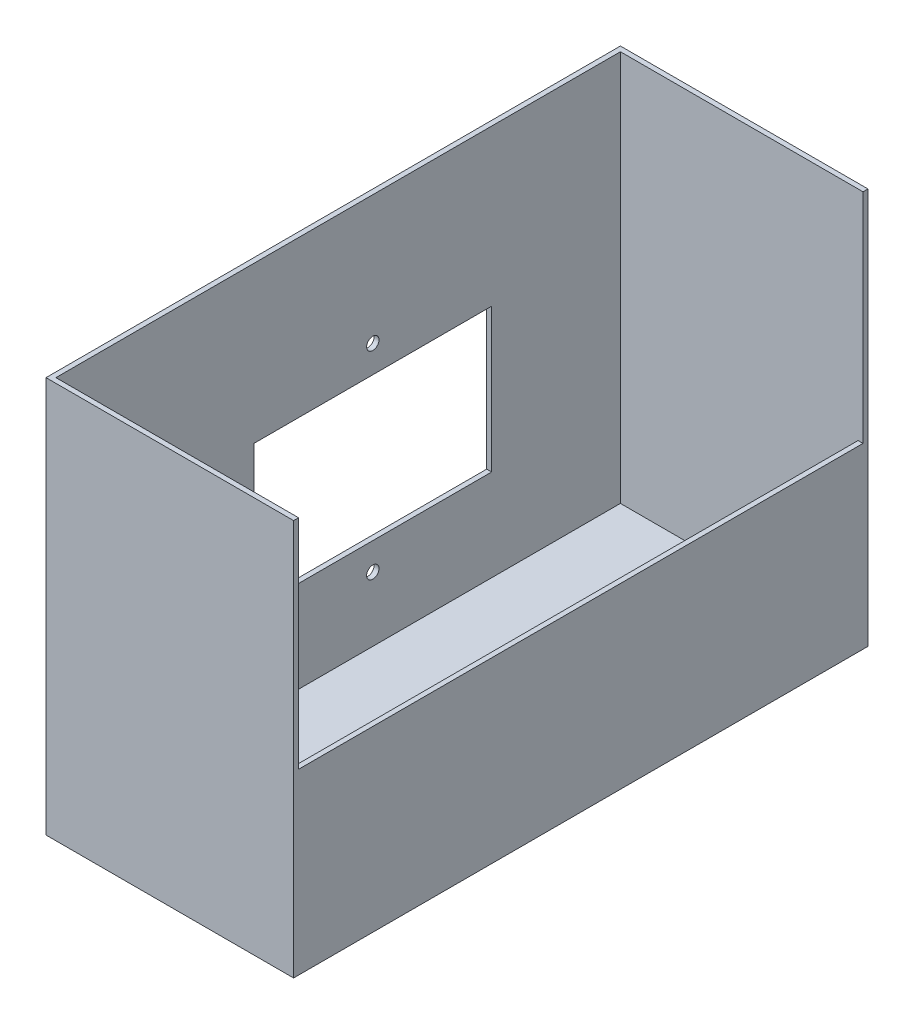
ISO-10303-21;
HEADER;
FILE_DESCRIPTION(('STEP AP214'),'2;1');
FILE_NAME('part.step','',(''),(''),'','','');
FILE_SCHEMA(('AUTOMOTIVE_DESIGN { 1 0 10303 214 1 1 1 1 }'));
ENDSEC;
DATA;
#1=APPLICATION_CONTEXT('core data for automotive mechanical design processes');
#2=APPLICATION_PROTOCOL_DEFINITION('international standard','automotive_design',2000,#1);
#3=PRODUCT_CONTEXT('',#1,'mechanical');
#4=PRODUCT('Part','Part','',(#3));
#5=PRODUCT_RELATED_PRODUCT_CATEGORY('part','',(#4));
#6=PRODUCT_DEFINITION_FORMATION('','',#4);
#7=PRODUCT_DEFINITION_CONTEXT('part definition',#1,'design');
#8=PRODUCT_DEFINITION('design','',#6,#7);
#9=PRODUCT_DEFINITION_SHAPE('','',#8);
#10=(LENGTH_UNIT() NAMED_UNIT(*) SI_UNIT(.MILLI.,.METRE.));
#11=(NAMED_UNIT(*) PLANE_ANGLE_UNIT() SI_UNIT($,.RADIAN.));
#12=(NAMED_UNIT(*) SI_UNIT($,.STERADIAN.) SOLID_ANGLE_UNIT());
#13=UNCERTAINTY_MEASURE_WITH_UNIT(LENGTH_MEASURE(1.E-05),#10,'distance_accuracy_value','');
#14=(GEOMETRIC_REPRESENTATION_CONTEXT(3) GLOBAL_UNCERTAINTY_ASSIGNED_CONTEXT((#13)) GLOBAL_UNIT_ASSIGNED_CONTEXT((#10,
#11,#12)) REPRESENTATION_CONTEXT('',''));
#15=CARTESIAN_POINT('',(0.,0.,0.));
#16=DIRECTION('',(0.,0.,1.));
#17=DIRECTION('',(1.,0.,0.));
#18=AXIS2_PLACEMENT_3D('',#15,#16,#17);
#19=CARTESIAN_POINT('',(0.,0.,0.));
#20=DIRECTION('',(1.,0.,0.));
#21=DIRECTION('',(0.,1.,0.));
#22=AXIS2_PLACEMENT_3D('',#19,#20,#21);
#23=PLANE('',#22);
#24=DIRECTION('',(0.,0.,-1.));
#25=VECTOR('',#24,1.);
#26=CARTESIAN_POINT('',(0.,-14.5,24.));
#27=LINE('',#26,#25);
#28=CARTESIAN_POINT('',(0.,-14.5,24.));
#29=VERTEX_POINT('',#28);
#30=CARTESIAN_POINT('',(0.,-14.5,-24.));
#31=VERTEX_POINT('',#30);
#32=EDGE_CURVE('E165',#29,#31,#27,.T.);
#33=ORIENTED_EDGE('',*,*,#32,.T.);
#34=DIRECTION('',(0.,1.,0.));
#35=VECTOR('',#34,1.);
#36=CARTESIAN_POINT('',(0.,-14.5,-24.));
#37=LINE('',#36,#35);
#38=CARTESIAN_POINT('',(0.,14.5,-24.));
#39=VERTEX_POINT('',#38);
#40=EDGE_CURVE('E172',#31,#39,#37,.T.);
#41=ORIENTED_EDGE('',*,*,#40,.T.);
#42=DIRECTION('',(0.,0.,1.));
#43=VECTOR('',#42,1.);
#44=CARTESIAN_POINT('',(0.,14.5,-24.));
#45=LINE('',#44,#43);
#46=CARTESIAN_POINT('',(0.,14.5,24.));
#47=VERTEX_POINT('',#46);
#48=EDGE_CURVE('E187',#39,#47,#45,.T.);
#49=ORIENTED_EDGE('',*,*,#48,.T.);
#50=DIRECTION('',(0.,-1.,0.));
#51=VECTOR('',#50,1.);
#52=CARTESIAN_POINT('',(0.,14.5,24.));
#53=LINE('',#52,#51);
#54=EDGE_CURVE('E645',#47,#29,#53,.T.);
#55=ORIENTED_EDGE('',*,*,#54,.T.);
#56=EDGE_LOOP('',(#33,#41,#49,#55));
#57=FACE_BOUND('',#56,.T.);
#58=CARTESIAN_POINT('',(0.,20.,0.));
#59=DIRECTION('',(-1.,0.,0.));
#60=DIRECTION('',(0.,0.,1.));
#61=AXIS2_PLACEMENT_3D('',#58,#59,#60);
#62=CIRCLE('',#61,1.25);
#63=CARTESIAN_POINT('',(0.,20.,1.25));
#64=VERTEX_POINT('',#63);
#65=EDGE_CURVE('E702',#64,#64,#62,.T.);
#66=ORIENTED_EDGE('',*,*,#65,.F.);
#67=EDGE_LOOP('',(#66));
#68=FACE_BOUND('',#67,.T.);
#69=CARTESIAN_POINT('',(0.,-20.,0.));
#70=DIRECTION('',(-1.,0.,0.));
#71=DIRECTION('',(0.,0.,1.));
#72=AXIS2_PLACEMENT_3D('',#69,#70,#71);
#73=CIRCLE('',#72,1.25);
#74=CARTESIAN_POINT('',(0.,-20.,1.25));
#75=VERTEX_POINT('',#74);
#76=EDGE_CURVE('E716',#75,#75,#73,.T.);
#77=ORIENTED_EDGE('',*,*,#76,.F.);
#78=EDGE_LOOP('',(#77));
#79=FACE_BOUND('',#78,.T.);
#80=DIRECTION('',(0.,0.,-1.));
#81=VECTOR('',#80,1.);
#82=CARTESIAN_POINT('',(0.,-34.,65.));
#83=LINE('',#82,#81);
#84=CARTESIAN_POINT('',(0.,-34.,65.));
#85=VERTEX_POINT('',#84);
#86=CARTESIAN_POINT('',(0.,-34.,-51.));
#87=VERTEX_POINT('',#86);
#88=EDGE_CURVE('E47',#85,#87,#83,.T.);
#89=ORIENTED_EDGE('',*,*,#88,.F.);
#90=DIRECTION('',(0.,-1.,0.));
#91=VECTOR('',#90,1.);
#92=CARTESIAN_POINT('',(0.,46.,65.));
#93=LINE('',#92,#91);
#94=CARTESIAN_POINT('',(0.,46.,65.));
#95=VERTEX_POINT('',#94);
#96=EDGE_CURVE('E192',#95,#85,#93,.T.);
#97=ORIENTED_EDGE('',*,*,#96,.F.);
#98=DIRECTION('',(0.,0.,1.));
#99=VECTOR('',#98,1.);
#100=CARTESIAN_POINT('',(0.,46.,-51.));
#101=LINE('',#100,#99);
#102=CARTESIAN_POINT('',(0.,46.,-51.));
#103=VERTEX_POINT('',#102);
#104=EDGE_CURVE('E270',#103,#95,#101,.T.);
#105=ORIENTED_EDGE('',*,*,#104,.F.);
#106=DIRECTION('',(0.,1.,0.));
#107=VECTOR('',#106,1.);
#108=CARTESIAN_POINT('',(0.,-34.,-51.));
#109=LINE('',#108,#107);
#110=EDGE_CURVE('E276',#87,#103,#109,.T.);
#111=ORIENTED_EDGE('',*,*,#110,.F.);
#112=EDGE_LOOP('',(#89,#97,#105,#111));
#113=FACE_BOUND('',#112,.T.);
#114=ADVANCED_FACE('F16',(#57,#68,#79,#113),#23,.F.);
#115=CARTESIAN_POINT('',(1.,2.,64.));
#116=DIRECTION('',(-1.,0.,0.));
#117=DIRECTION('',(0.,1.,0.));
#118=AXIS2_PLACEMENT_3D('',#115,#116,#117);
#119=PLANE('',#118);
#120=DIRECTION('',(0.,0.,-1.));
#121=VECTOR('',#120,1.);
#122=CARTESIAN_POINT('',(1.,-14.5,64.));
#123=LINE('',#122,#121);
#124=CARTESIAN_POINT('',(1.,-14.5,24.));
#125=VERTEX_POINT('',#124);
#126=CARTESIAN_POINT('',(1.,-14.5,-24.));
#127=VERTEX_POINT('',#126);
#128=EDGE_CURVE('E153',#125,#127,#123,.T.);
#129=ORIENTED_EDGE('',*,*,#128,.F.);
#130=DIRECTION('',(0.,-1.,0.));
#131=VECTOR('',#130,1.);
#132=CARTESIAN_POINT('',(1.,2.,24.));
#133=LINE('',#132,#131);
#134=CARTESIAN_POINT('',(1.,14.5,24.));
#135=VERTEX_POINT('',#134);
#136=EDGE_CURVE('E668',#135,#125,#133,.T.);
#137=ORIENTED_EDGE('',*,*,#136,.F.);
#138=DIRECTION('',(0.,0.,1.));
#139=VECTOR('',#138,1.);
#140=CARTESIAN_POINT('',(1.,14.5,64.));
#141=LINE('',#140,#139);
#142=CARTESIAN_POINT('',(1.,14.5,-24.));
#143=VERTEX_POINT('',#142);
#144=EDGE_CURVE('E178',#143,#135,#141,.T.);
#145=ORIENTED_EDGE('',*,*,#144,.F.);
#146=DIRECTION('',(0.,1.,0.));
#147=VECTOR('',#146,1.);
#148=CARTESIAN_POINT('',(1.,2.,-24.));
#149=LINE('',#148,#147);
#150=EDGE_CURVE('E170',#127,#143,#149,.T.);
#151=ORIENTED_EDGE('',*,*,#150,.F.);
#152=EDGE_LOOP('',(#129,#137,#145,#151));
#153=FACE_BOUND('',#152,.T.);
#154=CARTESIAN_POINT('',(0.999999999999987,20.,0.));
#155=DIRECTION('',(-1.,0.,0.));
#156=DIRECTION('',(0.,-1.,0.));
#157=AXIS2_PLACEMENT_3D('',#154,#155,#156);
#158=CIRCLE('',#157,1.25);
#159=CARTESIAN_POINT('',(0.999999999999988,18.75,0.));
#160=VERTEX_POINT('',#159);
#161=EDGE_CURVE('E711',#160,#160,#158,.T.);
#162=ORIENTED_EDGE('',*,*,#161,.T.);
#163=EDGE_LOOP('',(#162));
#164=FACE_BOUND('',#163,.T.);
#165=CARTESIAN_POINT('',(1.,-20.,0.));
#166=DIRECTION('',(-1.,0.,0.));
#167=DIRECTION('',(0.,-1.,0.));
#168=AXIS2_PLACEMENT_3D('',#165,#166,#167);
#169=CIRCLE('',#168,1.25);
#170=CARTESIAN_POINT('',(1.,-21.25,0.));
#171=VERTEX_POINT('',#170);
#172=EDGE_CURVE('E721',#171,#171,#169,.T.);
#173=ORIENTED_EDGE('',*,*,#172,.T.);
#174=EDGE_LOOP('',(#173));
#175=FACE_BOUND('',#174,.T.);
#176=DIRECTION('',(0.,-1.,0.));
#177=VECTOR('',#176,1.);
#178=CARTESIAN_POINT('',(1.,2.,-50.));
#179=LINE('',#178,#177);
#180=CARTESIAN_POINT('',(0.99999999999997,46.,-50.));
#181=VERTEX_POINT('',#180);
#182=CARTESIAN_POINT('',(1.,-33.,-50.));
#183=VERTEX_POINT('',#182);
#184=EDGE_CURVE('E233',#181,#183,#179,.T.);
#185=ORIENTED_EDGE('',*,*,#184,.F.);
#186=DIRECTION('',(0.,0.,-1.));
#187=VECTOR('',#186,1.);
#188=CARTESIAN_POINT('',(0.99999999999997,46.,64.));
#189=LINE('',#188,#187);
#190=CARTESIAN_POINT('',(0.99999999999997,46.,64.));
#191=VERTEX_POINT('',#190);
#192=EDGE_CURVE('E264',#191,#181,#189,.T.);
#193=ORIENTED_EDGE('',*,*,#192,.F.);
#194=DIRECTION('',(0.,-1.,0.));
#195=VECTOR('',#194,1.);
#196=CARTESIAN_POINT('',(1.,2.,64.));
#197=LINE('',#196,#195);
#198=CARTESIAN_POINT('',(1.,-33.,64.));
#199=VERTEX_POINT('',#198);
#200=EDGE_CURVE('E241',#191,#199,#197,.T.);
#201=ORIENTED_EDGE('',*,*,#200,.T.);
#202=DIRECTION('',(0.,0.,-1.));
#203=VECTOR('',#202,1.);
#204=CARTESIAN_POINT('',(1.,-33.,65.));
#205=LINE('',#204,#203);
#206=EDGE_CURVE('E202',#199,#183,#205,.T.);
#207=ORIENTED_EDGE('',*,*,#206,.T.);
#208=EDGE_LOOP('',(#185,#193,#201,#207));
#209=FACE_BOUND('',#208,.T.);
#210=ADVANCED_FACE('F176',(#153,#164,#175,#209),#119,.F.);
#211=CARTESIAN_POINT('',(50.,2.,64.));
#212=DIRECTION('',(0.,-1.,0.));
#213=DIRECTION('',(0.,0.,-1.));
#214=AXIS2_PLACEMENT_3D('',#211,#212,#213);
#215=PLANE('',#214);
#216=DIRECTION('',(0.,0.,-1.));
#217=VECTOR('',#216,1.);
#218=CARTESIAN_POINT('',(49.,2.,0.));
#219=LINE('',#218,#217);
#220=CARTESIAN_POINT('',(49.,2.,64.));
#221=VERTEX_POINT('',#220);
#222=CARTESIAN_POINT('',(49.,2.,-50.));
#223=VERTEX_POINT('',#222);
#224=EDGE_CURVE('E229',#221,#223,#219,.T.);
#225=ORIENTED_EDGE('',*,*,#224,.F.);
#226=DIRECTION('',(1.,0.,0.));
#227=VECTOR('',#226,1.);
#228=CARTESIAN_POINT('',(50.,2.,64.));
#229=LINE('',#228,#227);
#230=CARTESIAN_POINT('',(50.,2.,64.));
#231=VERTEX_POINT('',#230);
#232=EDGE_CURVE('E196',#221,#231,#229,.T.);
#233=ORIENTED_EDGE('',*,*,#232,.T.);
#234=DIRECTION('',(0.,0.,-1.));
#235=VECTOR('',#234,1.);
#236=CARTESIAN_POINT('',(50.,2.,64.));
#237=LINE('',#236,#235);
#238=CARTESIAN_POINT('',(50.,2.,-50.));
#239=VERTEX_POINT('',#238);
#240=EDGE_CURVE('E10',#231,#239,#237,.T.);
#241=ORIENTED_EDGE('',*,*,#240,.T.);
#242=DIRECTION('',(1.,0.,0.));
#243=VECTOR('',#242,1.);
#244=CARTESIAN_POINT('',(50.,2.,-50.));
#245=LINE('',#244,#243);
#246=EDGE_CURVE('E236',#223,#239,#245,.T.);
#247=ORIENTED_EDGE('',*,*,#246,.F.);
#248=EDGE_LOOP('',(#225,#233,#241,#247));
#249=FACE_BOUND('',#248,.T.);
#250=ADVANCED_FACE('F309',(#249),#215,.F.);
#251=CARTESIAN_POINT('',(50.,0.,0.));
#252=DIRECTION('',(1.,0.,0.));
#253=DIRECTION('',(0.,1.,0.));
#254=AXIS2_PLACEMENT_3D('',#251,#252,#253);
#255=PLANE('',#254);
#256=DIRECTION('',(0.,0.,1.));
#257=VECTOR('',#256,1.);
#258=CARTESIAN_POINT('',(50.,46.,-51.));
#259=LINE('',#258,#257);
#260=CARTESIAN_POINT('',(50.,46.,-51.));
#261=VERTEX_POINT('',#260);
#262=CARTESIAN_POINT('',(50.,46.,-50.));
#263=VERTEX_POINT('',#262);
#264=EDGE_CURVE('E267',#261,#263,#259,.T.);
#265=ORIENTED_EDGE('',*,*,#264,.T.);
#266=DIRECTION('',(0.,-1.,0.));
#267=VECTOR('',#266,1.);
#268=CARTESIAN_POINT('',(50.,46.,-50.));
#269=LINE('',#268,#267);
#270=EDGE_CURVE('E240',#263,#239,#269,.T.);
#271=ORIENTED_EDGE('',*,*,#270,.T.);
#272=ORIENTED_EDGE('',*,*,#240,.F.);
#273=DIRECTION('',(0.,-1.,0.));
#274=VECTOR('',#273,1.);
#275=CARTESIAN_POINT('',(50.,46.,64.));
#276=LINE('',#275,#274);
#277=CARTESIAN_POINT('',(50.,46.,64.));
#278=VERTEX_POINT('',#277);
#279=EDGE_CURVE('E252',#278,#231,#276,.T.);
#280=ORIENTED_EDGE('',*,*,#279,.F.);
#281=DIRECTION('',(0.,0.,1.));
#282=VECTOR('',#281,1.);
#283=CARTESIAN_POINT('',(50.,46.,-51.));
#284=LINE('',#283,#282);
#285=CARTESIAN_POINT('',(50.,46.,65.));
#286=VERTEX_POINT('',#285);
#287=EDGE_CURVE('E272',#278,#286,#284,.T.);
#288=ORIENTED_EDGE('',*,*,#287,.T.);
#289=DIRECTION('',(0.,-1.,0.));
#290=VECTOR('',#289,1.);
#291=CARTESIAN_POINT('',(50.,46.,65.));
#292=LINE('',#291,#290);
#293=CARTESIAN_POINT('',(50.,-34.,65.));
#294=VERTEX_POINT('',#293);
#295=EDGE_CURVE('E198',#286,#294,#292,.T.);
#296=ORIENTED_EDGE('',*,*,#295,.T.);
#297=DIRECTION('',(0.,0.,-1.));
#298=VECTOR('',#297,1.);
#299=CARTESIAN_POINT('',(50.,-34.,65.));
#300=LINE('',#299,#298);
#301=CARTESIAN_POINT('',(50.,-34.,-51.));
#302=VERTEX_POINT('',#301);
#303=EDGE_CURVE('E19',#294,#302,#300,.T.);
#304=ORIENTED_EDGE('',*,*,#303,.T.);
#305=DIRECTION('',(0.,1.,0.));
#306=VECTOR('',#305,1.);
#307=CARTESIAN_POINT('',(50.,-34.,-51.));
#308=LINE('',#307,#306);
#309=EDGE_CURVE('E226',#302,#261,#308,.T.);
#310=ORIENTED_EDGE('',*,*,#309,.T.);
#311=EDGE_LOOP('',(#265,#271,#272,#280,#288,#296,#304,#310));
#312=FACE_BOUND('',#311,.T.);
#313=ADVANCED_FACE('F316',(#312),#255,.T.);
#314=CARTESIAN_POINT('',(50.,-34.,65.));
#315=DIRECTION('',(0.,1.,0.));
#316=DIRECTION('',(0.,0.,-1.));
#317=AXIS2_PLACEMENT_3D('',#314,#315,#316);
#318=PLANE('',#317);
#319=CARTESIAN_POINT('',(20.,-34.,-31.));
#320=DIRECTION('',(0.,-1.,0.));
#321=DIRECTION('',(0.,0.,1.));
#322=AXIS2_PLACEMENT_3D('',#319,#320,#321);
#323=CIRCLE('',#322,2.75);
#324=CARTESIAN_POINT('',(20.,-34.,-28.25));
#325=VERTEX_POINT('',#324);
#326=EDGE_CURVE('E676',#325,#325,#323,.T.);
#327=ORIENTED_EDGE('',*,*,#326,.F.);
#328=EDGE_LOOP('',(#327));
#329=FACE_BOUND('',#328,.T.);
#330=ORIENTED_EDGE('',*,*,#88,.T.);
#331=DIRECTION('',(-1.,0.,0.));
#332=VECTOR('',#331,1.);
#333=CARTESIAN_POINT('',(50.,-34.,-51.));
#334=LINE('',#333,#332);
#335=EDGE_CURVE('E223',#302,#87,#334,.T.);
#336=ORIENTED_EDGE('',*,*,#335,.F.);
#337=ORIENTED_EDGE('',*,*,#303,.F.);
#338=DIRECTION('',(-1.,0.,0.));
#339=VECTOR('',#338,1.);
#340=CARTESIAN_POINT('',(50.,-34.,65.));
#341=LINE('',#340,#339);
#342=EDGE_CURVE('E195',#294,#85,#341,.T.);
#343=ORIENTED_EDGE('',*,*,#342,.T.);
#344=EDGE_LOOP('',(#330,#336,#337,#343));
#345=FACE_BOUND('',#344,.T.);
#346=ADVANCED_FACE('F325',(#329,#345),#318,.F.);
#347=CARTESIAN_POINT('',(50.,-34.,-51.));
#348=DIRECTION('',(0.,0.,1.));
#349=DIRECTION('',(0.,-1.,0.));
#350=AXIS2_PLACEMENT_3D('',#347,#348,#349);
#351=PLANE('',#350);
#352=ORIENTED_EDGE('',*,*,#110,.T.);
#353=DIRECTION('',(-1.,0.,0.));
#354=VECTOR('',#353,1.);
#355=CARTESIAN_POINT('',(50.,46.,-51.));
#356=LINE('',#355,#354);
#357=EDGE_CURVE('E190',#261,#103,#356,.T.);
#358=ORIENTED_EDGE('',*,*,#357,.F.);
#359=ORIENTED_EDGE('',*,*,#309,.F.);
#360=ORIENTED_EDGE('',*,*,#335,.T.);
#361=EDGE_LOOP('',(#352,#358,#359,#360));
#362=FACE_BOUND('',#361,.T.);
#363=ADVANCED_FACE('F333',(#362),#351,.F.);
#364=CARTESIAN_POINT('',(50.,46.,-51.));
#365=DIRECTION('',(0.,-1.,0.));
#366=DIRECTION('',(0.,0.,-1.));
#367=AXIS2_PLACEMENT_3D('',#364,#365,#366);
#368=PLANE('',#367);
#369=ORIENTED_EDGE('',*,*,#192,.T.);
#370=DIRECTION('',(1.,0.,0.));
#371=VECTOR('',#370,1.);
#372=CARTESIAN_POINT('',(0.999999999999972,46.,-50.));
#373=LINE('',#372,#371);
#374=EDGE_CURVE('E245',#181,#263,#373,.T.);
#375=ORIENTED_EDGE('',*,*,#374,.T.);
#376=ORIENTED_EDGE('',*,*,#264,.F.);
#377=ORIENTED_EDGE('',*,*,#357,.T.);
#378=ORIENTED_EDGE('',*,*,#104,.T.);
#379=DIRECTION('',(-1.,0.,0.));
#380=VECTOR('',#379,1.);
#381=CARTESIAN_POINT('',(50.,46.,65.));
#382=LINE('',#381,#380);
#383=EDGE_CURVE('E201',#286,#95,#382,.T.);
#384=ORIENTED_EDGE('',*,*,#383,.F.);
#385=ORIENTED_EDGE('',*,*,#287,.F.);
#386=DIRECTION('',(1.,0.,0.));
#387=VECTOR('',#386,1.);
#388=CARTESIAN_POINT('',(0.999999999999972,46.,64.));
#389=LINE('',#388,#387);
#390=EDGE_CURVE('E244',#191,#278,#389,.T.);
#391=ORIENTED_EDGE('',*,*,#390,.F.);
#392=EDGE_LOOP('',(#369,#375,#376,#377,#378,#384,#385,#391));
#393=FACE_BOUND('',#392,.T.);
#394=ADVANCED_FACE('F342',(#393),#368,.F.);
#395=CARTESIAN_POINT('',(50.,46.,65.));
#396=DIRECTION('',(0.,0.,-1.));
#397=DIRECTION('',(0.,-1.,0.));
#398=AXIS2_PLACEMENT_3D('',#395,#396,#397);
#399=PLANE('',#398);
#400=ORIENTED_EDGE('',*,*,#96,.T.);
#401=ORIENTED_EDGE('',*,*,#342,.F.);
#402=ORIENTED_EDGE('',*,*,#295,.F.);
#403=ORIENTED_EDGE('',*,*,#383,.T.);
#404=EDGE_LOOP('',(#400,#401,#402,#403));
#405=FACE_BOUND('',#404,.T.);
#406=ADVANCED_FACE('F353',(#405),#399,.F.);
#407=CARTESIAN_POINT('',(0.,0.,64.));
#408=DIRECTION('',(0.,0.,-1.));
#409=DIRECTION('',(0.,-1.,0.));
#410=AXIS2_PLACEMENT_3D('',#407,#408,#409);
#411=PLANE('',#410);
#412=ORIENTED_EDGE('',*,*,#200,.F.);
#413=ORIENTED_EDGE('',*,*,#390,.T.);
#414=ORIENTED_EDGE('',*,*,#279,.T.);
#415=ORIENTED_EDGE('',*,*,#232,.F.);
#416=DIRECTION('',(0.,-1.,0.));
#417=VECTOR('',#416,1.);
#418=CARTESIAN_POINT('',(49.,46.,64.));
#419=LINE('',#418,#417);
#420=CARTESIAN_POINT('',(49.,-33.,64.));
#421=VERTEX_POINT('',#420);
#422=EDGE_CURVE('E211',#221,#421,#419,.T.);
#423=ORIENTED_EDGE('',*,*,#422,.T.);
#424=DIRECTION('',(-1.,0.,0.));
#425=VECTOR('',#424,1.);
#426=CARTESIAN_POINT('',(50.,-33.,64.));
#427=LINE('',#426,#425);
#428=EDGE_CURVE('E206',#421,#199,#427,.T.);
#429=ORIENTED_EDGE('',*,*,#428,.T.);
#430=EDGE_LOOP('',(#412,#413,#414,#415,#423,#429));
#431=FACE_BOUND('',#430,.T.);
#432=ADVANCED_FACE('F348',(#431),#411,.T.);
#433=CARTESIAN_POINT('',(0.,0.,-50.));
#434=DIRECTION('',(0.,0.,-1.));
#435=DIRECTION('',(0.,-1.,0.));
#436=AXIS2_PLACEMENT_3D('',#433,#434,#435);
#437=PLANE('',#436);
#438=ORIENTED_EDGE('',*,*,#184,.T.);
#439=DIRECTION('',(-1.,0.,0.));
#440=VECTOR('',#439,1.);
#441=CARTESIAN_POINT('',(50.,-33.,-50.));
#442=LINE('',#441,#440);
#443=CARTESIAN_POINT('',(49.,-33.,-50.));
#444=VERTEX_POINT('',#443);
#445=EDGE_CURVE('E212',#444,#183,#442,.T.);
#446=ORIENTED_EDGE('',*,*,#445,.F.);
#447=DIRECTION('',(0.,1.,0.));
#448=VECTOR('',#447,1.);
#449=CARTESIAN_POINT('',(49.,-34.,-50.));
#450=LINE('',#449,#448);
#451=EDGE_CURVE('E207',#444,#223,#450,.T.);
#452=ORIENTED_EDGE('',*,*,#451,.T.);
#453=ORIENTED_EDGE('',*,*,#246,.T.);
#454=ORIENTED_EDGE('',*,*,#270,.F.);
#455=ORIENTED_EDGE('',*,*,#374,.F.);
#456=EDGE_LOOP('',(#438,#446,#452,#453,#454,#455));
#457=FACE_BOUND('',#456,.T.);
#458=ADVANCED_FACE('F352',(#457),#437,.F.);
#459=CARTESIAN_POINT('',(49.,0.,0.));
#460=DIRECTION('',(1.,0.,0.));
#461=DIRECTION('',(0.,1.,0.));
#462=AXIS2_PLACEMENT_3D('',#459,#460,#461);
#463=PLANE('',#462);
#464=ORIENTED_EDGE('',*,*,#451,.F.);
#465=DIRECTION('',(0.,0.,-1.));
#466=VECTOR('',#465,1.);
#467=CARTESIAN_POINT('',(49.,-33.,65.));
#468=LINE('',#467,#466);
#469=EDGE_CURVE('E216',#421,#444,#468,.T.);
#470=ORIENTED_EDGE('',*,*,#469,.F.);
#471=ORIENTED_EDGE('',*,*,#422,.F.);
#472=ORIENTED_EDGE('',*,*,#224,.T.);
#473=EDGE_LOOP('',(#464,#470,#471,#472));
#474=FACE_BOUND('',#473,.T.);
#475=ADVANCED_FACE('F370',(#474),#463,.F.);
#476=CARTESIAN_POINT('',(50.,-33.,65.));
#477=DIRECTION('',(0.,1.,0.));
#478=DIRECTION('',(0.,0.,-1.));
#479=AXIS2_PLACEMENT_3D('',#476,#477,#478);
#480=PLANE('',#479);
#481=CARTESIAN_POINT('',(20.,-33.,-31.));
#482=DIRECTION('',(0.,1.,0.));
#483=DIRECTION('',(0.,0.,1.));
#484=AXIS2_PLACEMENT_3D('',#481,#482,#483);
#485=CIRCLE('',#484,2.75);
#486=CARTESIAN_POINT('',(20.,-33.,-28.25));
#487=VERTEX_POINT('',#486);
#488=EDGE_CURVE('E693',#487,#487,#485,.T.);
#489=ORIENTED_EDGE('',*,*,#488,.F.);
#490=EDGE_LOOP('',(#489));
#491=FACE_BOUND('',#490,.T.);
#492=ORIENTED_EDGE('',*,*,#206,.F.);
#493=ORIENTED_EDGE('',*,*,#428,.F.);
#494=ORIENTED_EDGE('',*,*,#469,.T.);
#495=ORIENTED_EDGE('',*,*,#445,.T.);
#496=EDGE_LOOP('',(#492,#493,#494,#495));
#497=FACE_BOUND('',#496,.T.);
#498=ADVANCED_FACE('F376',(#491,#497),#480,.T.);
#499=CARTESIAN_POINT('',(20.,-14.5,24.));
#500=DIRECTION('',(0.,1.,0.));
#501=DIRECTION('',(0.,0.,-1.));
#502=AXIS2_PLACEMENT_3D('',#499,#500,#501);
#503=PLANE('',#502);
#504=ORIENTED_EDGE('',*,*,#128,.T.);
#505=DIRECTION('',(1.,0.,0.));
#506=VECTOR('',#505,1.);
#507=CARTESIAN_POINT('',(20.,-14.5,-24.));
#508=LINE('',#507,#506);
#509=EDGE_CURVE('E156',#31,#127,#508,.T.);
#510=ORIENTED_EDGE('',*,*,#509,.F.);
#511=ORIENTED_EDGE('',*,*,#32,.F.);
#512=DIRECTION('',(1.,0.,0.));
#513=VECTOR('',#512,1.);
#514=CARTESIAN_POINT('',(20.,-14.5,24.));
#515=LINE('',#514,#513);
#516=EDGE_CURVE('E159',#29,#125,#515,.T.);
#517=ORIENTED_EDGE('',*,*,#516,.T.);
#518=EDGE_LOOP('',(#504,#510,#511,#517));
#519=FACE_BOUND('',#518,.T.);
#520=ADVANCED_FACE('F155',(#519),#503,.T.);
#521=CARTESIAN_POINT('',(20.,-14.5,-24.));
#522=DIRECTION('',(0.,0.,1.));
#523=DIRECTION('',(1.,0.,0.));
#524=AXIS2_PLACEMENT_3D('',#521,#522,#523);
#525=PLANE('',#524);
#526=ORIENTED_EDGE('',*,*,#150,.T.);
#527=DIRECTION('',(1.,0.,0.));
#528=VECTOR('',#527,1.);
#529=CARTESIAN_POINT('',(20.,14.5,-24.));
#530=LINE('',#529,#528);
#531=EDGE_CURVE('E180',#39,#143,#530,.T.);
#532=ORIENTED_EDGE('',*,*,#531,.F.);
#533=ORIENTED_EDGE('',*,*,#40,.F.);
#534=ORIENTED_EDGE('',*,*,#509,.T.);
#535=EDGE_LOOP('',(#526,#532,#533,#534));
#536=FACE_BOUND('',#535,.T.);
#537=ADVANCED_FACE('F168',(#536),#525,.T.);
#538=CARTESIAN_POINT('',(20.,14.5,-24.));
#539=DIRECTION('',(0.,-1.,0.));
#540=DIRECTION('',(0.,0.,-1.));
#541=AXIS2_PLACEMENT_3D('',#538,#539,#540);
#542=PLANE('',#541);
#543=ORIENTED_EDGE('',*,*,#144,.T.);
#544=DIRECTION('',(1.,0.,0.));
#545=VECTOR('',#544,1.);
#546=CARTESIAN_POINT('',(20.,14.5,24.));
#547=LINE('',#546,#545);
#548=EDGE_CURVE('E636',#47,#135,#547,.T.);
#549=ORIENTED_EDGE('',*,*,#548,.F.);
#550=ORIENTED_EDGE('',*,*,#48,.F.);
#551=ORIENTED_EDGE('',*,*,#531,.T.);
#552=EDGE_LOOP('',(#543,#549,#550,#551));
#553=FACE_BOUND('',#552,.T.);
#554=ADVANCED_FACE('F395',(#553),#542,.T.);
#555=CARTESIAN_POINT('',(20.,14.5,24.));
#556=DIRECTION('',(0.,0.,-1.));
#557=DIRECTION('',(0.,-1.,0.));
#558=AXIS2_PLACEMENT_3D('',#555,#556,#557);
#559=PLANE('',#558);
#560=ORIENTED_EDGE('',*,*,#136,.T.);
#561=ORIENTED_EDGE('',*,*,#516,.F.);
#562=ORIENTED_EDGE('',*,*,#54,.F.);
#563=ORIENTED_EDGE('',*,*,#548,.T.);
#564=EDGE_LOOP('',(#560,#561,#562,#563));
#565=FACE_BOUND('',#564,.T.);
#566=ADVANCED_FACE('F419',(#565),#559,.T.);
#567=CARTESIAN_POINT('',(20.,-14.,-31.));
#568=DIRECTION('',(0.,-1.,0.));
#569=DIRECTION('',(0.,0.,-1.));
#570=AXIS2_PLACEMENT_3D('',#567,#568,#569);
#571=CYLINDRICAL_SURFACE('',#570,2.75);
#572=ORIENTED_EDGE('',*,*,#326,.T.);
#573=EDGE_LOOP('',(#572));
#574=FACE_BOUND('',#573,.T.);
#575=ORIENTED_EDGE('',*,*,#488,.T.);
#576=EDGE_LOOP('',(#575));
#577=FACE_BOUND('',#576,.T.);
#578=ADVANCED_FACE('F428',(#574,#577),#571,.F.);
#579=CARTESIAN_POINT('',(20.,20.,0.));
#580=DIRECTION('',(-1.,0.,0.));
#581=DIRECTION('',(0.,0.,1.));
#582=AXIS2_PLACEMENT_3D('',#579,#580,#581);
#583=CYLINDRICAL_SURFACE('',#582,1.25);
#584=ORIENTED_EDGE('',*,*,#65,.T.);
#585=EDGE_LOOP('',(#584));
#586=FACE_BOUND('',#585,.T.);
#587=ORIENTED_EDGE('',*,*,#161,.F.);
#588=EDGE_LOOP('',(#587));
#589=FACE_BOUND('',#588,.T.);
#590=ADVANCED_FACE('F434',(#586,#589),#583,.F.);
#591=CARTESIAN_POINT('',(20.,-20.,0.));
#592=DIRECTION('',(-1.,0.,0.));
#593=DIRECTION('',(0.,0.,1.));
#594=AXIS2_PLACEMENT_3D('',#591,#592,#593);
#595=CYLINDRICAL_SURFACE('',#594,1.25);
#596=ORIENTED_EDGE('',*,*,#76,.T.);
#597=EDGE_LOOP('',(#596));
#598=FACE_BOUND('',#597,.T.);
#599=ORIENTED_EDGE('',*,*,#172,.F.);
#600=EDGE_LOOP('',(#599));
#601=FACE_BOUND('',#600,.T.);
#602=ADVANCED_FACE('F438',(#598,#601),#595,.F.);
#603=CLOSED_SHELL('',(#114,#210,#250,#313,#346,#363,#394,#406,#432,#458,#475,#498,#520,#537,
#554,#566,#578,#590,#602));
#604=MANIFOLD_SOLID_BREP('B1',#603);
#605=ADVANCED_BREP_SHAPE_REPRESENTATION('',(#18,#604),#14);
#606=SHAPE_DEFINITION_REPRESENTATION(#9,#605);
ENDSEC;
END-ISO-10303-21;
